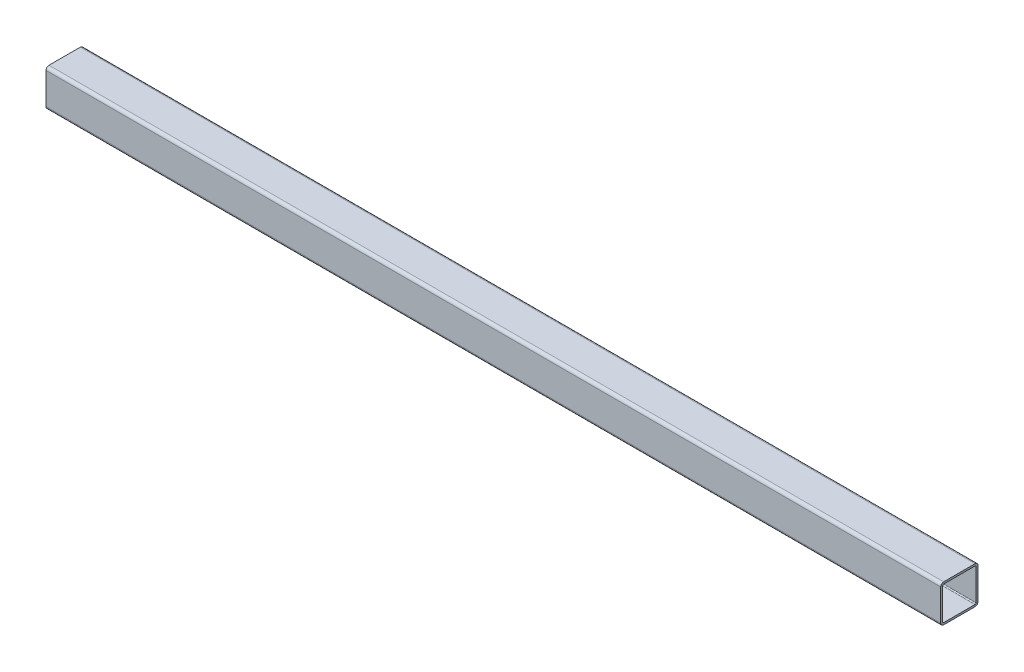
ISO-10303-21;
HEADER;
FILE_DESCRIPTION(('STEP AP214'),'2;1');
FILE_NAME('part.step','',(''),(''),'','','');
FILE_SCHEMA(('AUTOMOTIVE_DESIGN { 1 0 10303 214 1 1 1 1 }'));
ENDSEC;
DATA;
#1=APPLICATION_CONTEXT('core data for automotive mechanical design processes');
#2=APPLICATION_PROTOCOL_DEFINITION('international standard','automotive_design',2000,#1);
#3=PRODUCT_CONTEXT('',#1,'mechanical');
#4=PRODUCT('Part','Part','',(#3));
#5=PRODUCT_RELATED_PRODUCT_CATEGORY('part','',(#4));
#6=PRODUCT_DEFINITION_FORMATION('','',#4);
#7=PRODUCT_DEFINITION_CONTEXT('part definition',#1,'design');
#8=PRODUCT_DEFINITION('design','',#6,#7);
#9=PRODUCT_DEFINITION_SHAPE('','',#8);
#10=(LENGTH_UNIT() NAMED_UNIT(*) SI_UNIT(.MILLI.,.METRE.));
#11=(NAMED_UNIT(*) PLANE_ANGLE_UNIT() SI_UNIT($,.RADIAN.));
#12=(NAMED_UNIT(*) SI_UNIT($,.STERADIAN.) SOLID_ANGLE_UNIT());
#13=UNCERTAINTY_MEASURE_WITH_UNIT(LENGTH_MEASURE(1.E-05),#10,'distance_accuracy_value','');
#14=(GEOMETRIC_REPRESENTATION_CONTEXT(3) GLOBAL_UNCERTAINTY_ASSIGNED_CONTEXT((#13)) GLOBAL_UNIT_ASSIGNED_CONTEXT((#10,
#11,#12)) REPRESENTATION_CONTEXT('',''));
#15=CARTESIAN_POINT('',(0.,0.,0.));
#16=DIRECTION('',(0.,0.,1.));
#17=DIRECTION('',(1.,0.,0.));
#18=AXIS2_PLACEMENT_3D('',#15,#16,#17);
#19=CARTESIAN_POINT('',(304.8,10.541,21.209));
#20=DIRECTION('',(1.,0.,0.));
#21=DIRECTION('',(0.,0.,-1.));
#22=AXIS2_PLACEMENT_3D('',#19,#20,#21);
#23=PLANE('',#22);
#24=CARTESIAN_POINT('',(304.8,10.541,21.209));
#25=DIRECTION('',(1.,0.,0.));
#26=DIRECTION('',(0.,0.,-1.));
#27=AXIS2_PLACEMENT_3D('',#24,#25,#26);
#28=CIRCLE('',#27,1.016);
#29=CARTESIAN_POINT('',(304.8,10.541,22.225));
#30=VERTEX_POINT('',#29);
#31=CARTESIAN_POINT('',(304.8,9.525,21.209));
#32=VERTEX_POINT('',#31);
#33=EDGE_CURVE('E266',#30,#32,#28,.T.);
#34=ORIENTED_EDGE('',*,*,#33,.T.);
#35=DIRECTION('',(0.,0.,-1.));
#36=VECTOR('',#35,1.);
#37=CARTESIAN_POINT('',(304.8,9.525,21.209));
#38=LINE('',#37,#36);
#39=CARTESIAN_POINT('',(304.8,9.525,10.541));
#40=VERTEX_POINT('',#39);
#41=EDGE_CURVE('E494',#32,#40,#38,.T.);
#42=ORIENTED_EDGE('',*,*,#41,.T.);
#43=CARTESIAN_POINT('',(304.8,10.541,10.541));
#44=DIRECTION('',(1.,0.,0.));
#45=DIRECTION('',(0.,0.,-1.));
#46=AXIS2_PLACEMENT_3D('',#43,#44,#45);
#47=CIRCLE('',#46,1.016);
#48=CARTESIAN_POINT('',(304.8,10.541,9.525));
#49=VERTEX_POINT('',#48);
#50=EDGE_CURVE('E167',#40,#49,#47,.T.);
#51=ORIENTED_EDGE('',*,*,#50,.T.);
#52=DIRECTION('',(0.,1.,0.));
#53=VECTOR('',#52,1.);
#54=CARTESIAN_POINT('',(304.8,10.541,9.525));
#55=LINE('',#54,#53);
#56=CARTESIAN_POINT('',(304.8,21.209,9.525));
#57=VERTEX_POINT('',#56);
#58=EDGE_CURVE('E480',#49,#57,#55,.T.);
#59=ORIENTED_EDGE('',*,*,#58,.T.);
#60=CARTESIAN_POINT('',(304.8,21.209,10.541));
#61=DIRECTION('',(1.,0.,0.));
#62=DIRECTION('',(0.,0.,-1.));
#63=AXIS2_PLACEMENT_3D('',#60,#61,#62);
#64=CIRCLE('',#63,1.016);
#65=CARTESIAN_POINT('',(304.8,22.225,10.541));
#66=VERTEX_POINT('',#65);
#67=EDGE_CURVE('E489',#57,#66,#64,.T.);
#68=ORIENTED_EDGE('',*,*,#67,.T.);
#69=DIRECTION('',(0.,0.,1.));
#70=VECTOR('',#69,1.);
#71=CARTESIAN_POINT('',(304.8,22.225,10.541));
#72=LINE('',#71,#70);
#73=CARTESIAN_POINT('',(304.8,22.225,21.209));
#74=VERTEX_POINT('',#73);
#75=EDGE_CURVE('E282',#66,#74,#72,.T.);
#76=ORIENTED_EDGE('',*,*,#75,.T.);
#77=CARTESIAN_POINT('',(304.8,21.209,21.209));
#78=DIRECTION('',(1.,0.,0.));
#79=DIRECTION('',(0.,0.,-1.));
#80=AXIS2_PLACEMENT_3D('',#77,#78,#79);
#81=CIRCLE('',#80,1.016);
#82=CARTESIAN_POINT('',(304.8,21.209,22.225));
#83=VERTEX_POINT('',#82);
#84=EDGE_CURVE('E299',#74,#83,#81,.T.);
#85=ORIENTED_EDGE('',*,*,#84,.T.);
#86=DIRECTION('',(0.,-1.,0.));
#87=VECTOR('',#86,1.);
#88=CARTESIAN_POINT('',(304.8,21.209,22.225));
#89=LINE('',#88,#87);
#90=EDGE_CURVE('E263',#83,#30,#89,.T.);
#91=ORIENTED_EDGE('',*,*,#90,.T.);
#92=EDGE_LOOP('',(#34,#42,#51,#59,#68,#76,#85,#91));
#93=FACE_BOUND('',#92,.T.);
#94=DIRECTION('',(0.,1.,0.));
#95=VECTOR('',#94,1.);
#96=CARTESIAN_POINT('',(304.8,10.541,10.1854));
#97=LINE('',#96,#95);
#98=CARTESIAN_POINT('',(304.8,10.541,10.1854));
#99=VERTEX_POINT('',#98);
#100=CARTESIAN_POINT('',(304.8,21.209,10.1854));
#101=VERTEX_POINT('',#100);
#102=EDGE_CURVE('E259',#99,#101,#97,.T.);
#103=ORIENTED_EDGE('',*,*,#102,.F.);
#104=CARTESIAN_POINT('',(304.8,10.541,10.541));
#105=DIRECTION('',(1.,0.,0.));
#106=DIRECTION('',(0.,0.,-1.));
#107=AXIS2_PLACEMENT_3D('',#104,#105,#106);
#108=CIRCLE('',#107,0.355600000000001);
#109=CARTESIAN_POINT('',(304.8,10.1854,10.541));
#110=VERTEX_POINT('',#109);
#111=EDGE_CURVE('E106',#110,#99,#108,.T.);
#112=ORIENTED_EDGE('',*,*,#111,.F.);
#113=DIRECTION('',(0.,0.,-1.));
#114=VECTOR('',#113,1.);
#115=CARTESIAN_POINT('',(304.8,10.1854,21.209));
#116=LINE('',#115,#114);
#117=CARTESIAN_POINT('',(304.8,10.1854,21.209));
#118=VERTEX_POINT('',#117);
#119=EDGE_CURVE('E218',#118,#110,#116,.T.);
#120=ORIENTED_EDGE('',*,*,#119,.F.);
#121=CARTESIAN_POINT('',(304.8,10.541,21.209));
#122=DIRECTION('',(1.,0.,0.));
#123=DIRECTION('',(0.,0.,-1.));
#124=AXIS2_PLACEMENT_3D('',#121,#122,#123);
#125=CIRCLE('',#124,0.355599999999998);
#126=CARTESIAN_POINT('',(304.8,10.541,21.5646));
#127=VERTEX_POINT('',#126);
#128=EDGE_CURVE('E249',#127,#118,#125,.T.);
#129=ORIENTED_EDGE('',*,*,#128,.F.);
#130=DIRECTION('',(0.,-1.,0.));
#131=VECTOR('',#130,1.);
#132=CARTESIAN_POINT('',(304.8,21.209,21.5646));
#133=LINE('',#132,#131);
#134=CARTESIAN_POINT('',(304.8,21.209,21.5646));
#135=VERTEX_POINT('',#134);
#136=EDGE_CURVE('E235',#135,#127,#133,.T.);
#137=ORIENTED_EDGE('',*,*,#136,.F.);
#138=CARTESIAN_POINT('',(304.8,21.209,21.209));
#139=DIRECTION('',(1.,0.,0.));
#140=DIRECTION('',(0.,0.,-1.));
#141=AXIS2_PLACEMENT_3D('',#138,#139,#140);
#142=CIRCLE('',#141,0.355600000000006);
#143=CARTESIAN_POINT('',(304.8,21.5646,21.209));
#144=VERTEX_POINT('',#143);
#145=EDGE_CURVE('E244',#144,#135,#142,.T.);
#146=ORIENTED_EDGE('',*,*,#145,.F.);
#147=DIRECTION('',(0.,0.,1.));
#148=VECTOR('',#147,1.);
#149=CARTESIAN_POINT('',(304.8,21.5646,10.541));
#150=LINE('',#149,#148);
#151=CARTESIAN_POINT('',(304.8,21.5646,10.541));
#152=VERTEX_POINT('',#151);
#153=EDGE_CURVE('E252',#152,#144,#150,.T.);
#154=ORIENTED_EDGE('',*,*,#153,.F.);
#155=CARTESIAN_POINT('',(304.8,21.209,10.541));
#156=DIRECTION('',(1.,2.66488927723138E-13,-2.66488927723138E-13));
#157=DIRECTION('',(-2.66488927723138E-13,0.,-1.));
#158=AXIS2_PLACEMENT_3D('',#155,#156,#157);
#159=CIRCLE('',#158,0.355599999999998);
#160=EDGE_CURVE('E257',#101,#152,#159,.T.);
#161=ORIENTED_EDGE('',*,*,#160,.F.);
#162=EDGE_LOOP('',(#103,#112,#120,#129,#137,#146,#154,#161));
#163=FACE_BOUND('',#162,.T.);
#164=ADVANCED_FACE('F47',(#93,#163),#23,.T.);
#165=CARTESIAN_POINT('',(0.,10.541,21.209));
#166=DIRECTION('',(1.,0.,0.));
#167=DIRECTION('',(0.,0.,-1.));
#168=AXIS2_PLACEMENT_3D('',#165,#166,#167);
#169=PLANE('',#168);
#170=CARTESIAN_POINT('',(0.,10.541,21.209));
#171=DIRECTION('',(1.,0.,0.));
#172=DIRECTION('',(0.,0.,-1.));
#173=AXIS2_PLACEMENT_3D('',#170,#171,#172);
#174=CIRCLE('',#173,1.016);
#175=CARTESIAN_POINT('',(0.,10.541,22.225));
#176=VERTEX_POINT('',#175);
#177=CARTESIAN_POINT('',(0.,9.525,21.209));
#178=VERTEX_POINT('',#177);
#179=EDGE_CURVE('E160',#176,#178,#174,.T.);
#180=ORIENTED_EDGE('',*,*,#179,.F.);
#181=DIRECTION('',(0.,-1.,0.));
#182=VECTOR('',#181,1.);
#183=CARTESIAN_POINT('',(0.,21.209,22.225));
#184=LINE('',#183,#182);
#185=CARTESIAN_POINT('',(0.,21.209,22.225));
#186=VERTEX_POINT('',#185);
#187=EDGE_CURVE('E264',#186,#176,#184,.T.);
#188=ORIENTED_EDGE('',*,*,#187,.F.);
#189=CARTESIAN_POINT('',(0.,21.209,21.209));
#190=DIRECTION('',(1.,0.,0.));
#191=DIRECTION('',(0.,0.,-1.));
#192=AXIS2_PLACEMENT_3D('',#189,#190,#191);
#193=CIRCLE('',#192,1.016);
#194=CARTESIAN_POINT('',(0.,22.225,21.209));
#195=VERTEX_POINT('',#194);
#196=EDGE_CURVE('E267',#195,#186,#193,.T.);
#197=ORIENTED_EDGE('',*,*,#196,.F.);
#198=DIRECTION('',(0.,0.,1.));
#199=VECTOR('',#198,1.);
#200=CARTESIAN_POINT('',(0.,22.225,10.541));
#201=LINE('',#200,#199);
#202=CARTESIAN_POINT('',(0.,22.225,10.541));
#203=VERTEX_POINT('',#202);
#204=EDGE_CURVE('E269',#203,#195,#201,.T.);
#205=ORIENTED_EDGE('',*,*,#204,.F.);
#206=CARTESIAN_POINT('',(0.,21.209,10.541));
#207=DIRECTION('',(1.,0.,0.));
#208=DIRECTION('',(0.,0.,-1.));
#209=AXIS2_PLACEMENT_3D('',#206,#207,#208);
#210=CIRCLE('',#209,1.016);
#211=CARTESIAN_POINT('',(0.,21.209,9.525));
#212=VERTEX_POINT('',#211);
#213=EDGE_CURVE('E176',#212,#203,#210,.T.);
#214=ORIENTED_EDGE('',*,*,#213,.F.);
#215=DIRECTION('',(0.,1.,0.));
#216=VECTOR('',#215,1.);
#217=CARTESIAN_POINT('',(0.,10.541,9.525));
#218=LINE('',#217,#216);
#219=CARTESIAN_POINT('',(0.,10.541,9.525));
#220=VERTEX_POINT('',#219);
#221=EDGE_CURVE('E174',#220,#212,#218,.T.);
#222=ORIENTED_EDGE('',*,*,#221,.F.);
#223=CARTESIAN_POINT('',(0.,10.541,10.541));
#224=DIRECTION('',(1.,0.,0.));
#225=DIRECTION('',(0.,0.,-1.));
#226=AXIS2_PLACEMENT_3D('',#223,#224,#225);
#227=CIRCLE('',#226,1.016);
#228=CARTESIAN_POINT('',(0.,9.525,10.541));
#229=VERTEX_POINT('',#228);
#230=EDGE_CURVE('E159',#229,#220,#227,.T.);
#231=ORIENTED_EDGE('',*,*,#230,.F.);
#232=DIRECTION('',(0.,0.,-1.));
#233=VECTOR('',#232,1.);
#234=CARTESIAN_POINT('',(0.,9.525,21.209));
#235=LINE('',#234,#233);
#236=EDGE_CURVE('E149',#178,#229,#235,.T.);
#237=ORIENTED_EDGE('',*,*,#236,.F.);
#238=EDGE_LOOP('',(#180,#188,#197,#205,#214,#222,#231,#237));
#239=FACE_BOUND('',#238,.T.);
#240=CARTESIAN_POINT('',(0.,10.541,10.541));
#241=DIRECTION('',(1.,0.,0.));
#242=DIRECTION('',(0.,0.,-1.));
#243=AXIS2_PLACEMENT_3D('',#240,#241,#242);
#244=CIRCLE('',#243,0.355600000000001);
#245=CARTESIAN_POINT('',(0.,10.1854,10.541));
#246=VERTEX_POINT('',#245);
#247=CARTESIAN_POINT('',(0.,10.541,10.1854));
#248=VERTEX_POINT('',#247);
#249=EDGE_CURVE('E72',#246,#248,#244,.T.);
#250=ORIENTED_EDGE('',*,*,#249,.T.);
#251=DIRECTION('',(0.,1.,0.));
#252=VECTOR('',#251,1.);
#253=CARTESIAN_POINT('',(0.,10.541,10.1854));
#254=LINE('',#253,#252);
#255=CARTESIAN_POINT('',(0.,21.209,10.1854));
#256=VERTEX_POINT('',#255);
#257=EDGE_CURVE('E181',#248,#256,#254,.T.);
#258=ORIENTED_EDGE('',*,*,#257,.T.);
#259=CARTESIAN_POINT('',(0.,21.209,10.541));
#260=DIRECTION('',(1.,0.,0.));
#261=DIRECTION('',(0.,0.,-1.));
#262=AXIS2_PLACEMENT_3D('',#259,#260,#261);
#263=CIRCLE('',#262,0.355599999999998);
#264=CARTESIAN_POINT('',(0.,21.5646,10.541));
#265=VERTEX_POINT('',#264);
#266=EDGE_CURVE('E184',#256,#265,#263,.T.);
#267=ORIENTED_EDGE('',*,*,#266,.T.);
#268=DIRECTION('',(0.,0.,1.));
#269=VECTOR('',#268,1.);
#270=CARTESIAN_POINT('',(0.,21.5646,10.541));
#271=LINE('',#270,#269);
#272=CARTESIAN_POINT('',(0.,21.5646,21.209));
#273=VERTEX_POINT('',#272);
#274=EDGE_CURVE('E187',#265,#273,#271,.T.);
#275=ORIENTED_EDGE('',*,*,#274,.T.);
#276=CARTESIAN_POINT('',(0.,21.209,21.209));
#277=DIRECTION('',(1.,0.,0.));
#278=DIRECTION('',(0.,0.,-1.));
#279=AXIS2_PLACEMENT_3D('',#276,#277,#278);
#280=CIRCLE('',#279,0.355600000000006);
#281=CARTESIAN_POINT('',(0.,21.209,21.5646));
#282=VERTEX_POINT('',#281);
#283=EDGE_CURVE('E190',#273,#282,#280,.T.);
#284=ORIENTED_EDGE('',*,*,#283,.T.);
#285=DIRECTION('',(0.,-1.,0.));
#286=VECTOR('',#285,1.);
#287=CARTESIAN_POINT('',(0.,21.209,21.5646));
#288=LINE('',#287,#286);
#289=CARTESIAN_POINT('',(0.,10.541,21.5646));
#290=VERTEX_POINT('',#289);
#291=EDGE_CURVE('E193',#282,#290,#288,.T.);
#292=ORIENTED_EDGE('',*,*,#291,.T.);
#293=CARTESIAN_POINT('',(0.,10.541,21.209));
#294=DIRECTION('',(1.,0.,0.));
#295=DIRECTION('',(0.,0.,-1.));
#296=AXIS2_PLACEMENT_3D('',#293,#294,#295);
#297=CIRCLE('',#296,0.355599999999998);
#298=CARTESIAN_POINT('',(0.,10.1854,21.209));
#299=VERTEX_POINT('',#298);
#300=EDGE_CURVE('E196',#290,#299,#297,.T.);
#301=ORIENTED_EDGE('',*,*,#300,.T.);
#302=DIRECTION('',(0.,0.,-1.));
#303=VECTOR('',#302,1.);
#304=CARTESIAN_POINT('',(0.,10.1854,21.209));
#305=LINE('',#304,#303);
#306=EDGE_CURVE('E199',#299,#246,#305,.T.);
#307=ORIENTED_EDGE('',*,*,#306,.T.);
#308=EDGE_LOOP('',(#250,#258,#267,#275,#284,#292,#301,#307));
#309=FACE_BOUND('',#308,.T.);
#310=ADVANCED_FACE('F171',(#239,#309),#169,.F.);
#311=CARTESIAN_POINT('',(304.8,10.541,21.209));
#312=DIRECTION('',(-1.,0.,0.));
#313=DIRECTION('',(0.,-1.,0.));
#314=AXIS2_PLACEMENT_3D('',#311,#312,#313);
#315=CYLINDRICAL_SURFACE('',#314,1.016);
#316=ORIENTED_EDGE('',*,*,#179,.T.);
#317=DIRECTION('',(-1.,0.,0.));
#318=VECTOR('',#317,1.);
#319=CARTESIAN_POINT('',(304.8,9.525,21.209));
#320=LINE('',#319,#318);
#321=EDGE_CURVE('E11',#32,#178,#320,.T.);
#322=ORIENTED_EDGE('',*,*,#321,.F.);
#323=ORIENTED_EDGE('',*,*,#33,.F.);
#324=DIRECTION('',(-1.,0.,0.));
#325=VECTOR('',#324,1.);
#326=CARTESIAN_POINT('',(304.8,10.541,22.225));
#327=LINE('',#326,#325);
#328=EDGE_CURVE('E215',#30,#176,#327,.T.);
#329=ORIENTED_EDGE('',*,*,#328,.T.);
#330=EDGE_LOOP('',(#316,#322,#323,#329));
#331=FACE_BOUND('',#330,.T.);
#332=ADVANCED_FACE('F329',(#331),#315,.T.);
#333=CARTESIAN_POINT('',(304.8,9.525,21.209));
#334=DIRECTION('',(0.,1.,0.));
#335=DIRECTION('',(0.,0.,1.));
#336=AXIS2_PLACEMENT_3D('',#333,#334,#335);
#337=PLANE('',#336);
#338=ORIENTED_EDGE('',*,*,#236,.T.);
#339=DIRECTION('',(-1.,0.,0.));
#340=VECTOR('',#339,1.);
#341=CARTESIAN_POINT('',(304.8,9.525,10.541));
#342=LINE('',#341,#340);
#343=EDGE_CURVE('E56',#40,#229,#342,.T.);
#344=ORIENTED_EDGE('',*,*,#343,.F.);
#345=ORIENTED_EDGE('',*,*,#41,.F.);
#346=ORIENTED_EDGE('',*,*,#321,.T.);
#347=EDGE_LOOP('',(#338,#344,#345,#346));
#348=FACE_BOUND('',#347,.T.);
#349=ADVANCED_FACE('F153',(#348),#337,.F.);
#350=CARTESIAN_POINT('',(304.8,10.541,10.541));
#351=DIRECTION('',(-1.,0.,0.));
#352=DIRECTION('',(0.,-1.,0.));
#353=AXIS2_PLACEMENT_3D('',#350,#351,#352);
#354=CYLINDRICAL_SURFACE('',#353,1.016);
#355=ORIENTED_EDGE('',*,*,#230,.T.);
#356=DIRECTION('',(-1.,0.,0.));
#357=VECTOR('',#356,1.);
#358=CARTESIAN_POINT('',(304.8,10.541,9.525));
#359=LINE('',#358,#357);
#360=EDGE_CURVE('E168',#49,#220,#359,.T.);
#361=ORIENTED_EDGE('',*,*,#360,.F.);
#362=ORIENTED_EDGE('',*,*,#50,.F.);
#363=ORIENTED_EDGE('',*,*,#343,.T.);
#364=EDGE_LOOP('',(#355,#361,#362,#363));
#365=FACE_BOUND('',#364,.T.);
#366=ADVANCED_FACE('F163',(#365),#354,.T.);
#367=CARTESIAN_POINT('',(304.8,10.541,9.525));
#368=DIRECTION('',(0.,0.,1.));
#369=DIRECTION('',(1.,0.,0.));
#370=AXIS2_PLACEMENT_3D('',#367,#368,#369);
#371=PLANE('',#370);
#372=ORIENTED_EDGE('',*,*,#221,.T.);
#373=DIRECTION('',(-1.,0.,0.));
#374=VECTOR('',#373,1.);
#375=CARTESIAN_POINT('',(304.8,21.209,9.525));
#376=LINE('',#375,#374);
#377=EDGE_CURVE('E203',#57,#212,#376,.T.);
#378=ORIENTED_EDGE('',*,*,#377,.F.);
#379=ORIENTED_EDGE('',*,*,#58,.F.);
#380=ORIENTED_EDGE('',*,*,#360,.T.);
#381=EDGE_LOOP('',(#372,#378,#379,#380));
#382=FACE_BOUND('',#381,.T.);
#383=ADVANCED_FACE('F339',(#382),#371,.F.);
#384=CARTESIAN_POINT('',(304.8,21.209,10.541));
#385=DIRECTION('',(-1.,0.,0.));
#386=DIRECTION('',(0.,-1.,0.));
#387=AXIS2_PLACEMENT_3D('',#384,#385,#386);
#388=CYLINDRICAL_SURFACE('',#387,1.016);
#389=ORIENTED_EDGE('',*,*,#213,.T.);
#390=DIRECTION('',(-1.,0.,0.));
#391=VECTOR('',#390,1.);
#392=CARTESIAN_POINT('',(304.8,22.225,10.541));
#393=LINE('',#392,#391);
#394=EDGE_CURVE('E206',#66,#203,#393,.T.);
#395=ORIENTED_EDGE('',*,*,#394,.F.);
#396=ORIENTED_EDGE('',*,*,#67,.F.);
#397=ORIENTED_EDGE('',*,*,#377,.T.);
#398=EDGE_LOOP('',(#389,#395,#396,#397));
#399=FACE_BOUND('',#398,.T.);
#400=ADVANCED_FACE('F272',(#399),#388,.T.);
#401=CARTESIAN_POINT('',(304.8,22.225,10.541));
#402=DIRECTION('',(0.,-1.,0.));
#403=DIRECTION('',(0.,0.,-1.));
#404=AXIS2_PLACEMENT_3D('',#401,#402,#403);
#405=PLANE('',#404);
#406=ORIENTED_EDGE('',*,*,#204,.T.);
#407=DIRECTION('',(-1.,0.,0.));
#408=VECTOR('',#407,1.);
#409=CARTESIAN_POINT('',(304.8,22.225,21.209));
#410=LINE('',#409,#408);
#411=EDGE_CURVE('E209',#74,#195,#410,.T.);
#412=ORIENTED_EDGE('',*,*,#411,.F.);
#413=ORIENTED_EDGE('',*,*,#75,.F.);
#414=ORIENTED_EDGE('',*,*,#394,.T.);
#415=EDGE_LOOP('',(#406,#412,#413,#414));
#416=FACE_BOUND('',#415,.T.);
#417=ADVANCED_FACE('F279',(#416),#405,.F.);
#418=CARTESIAN_POINT('',(304.8,21.209,21.209));
#419=DIRECTION('',(-1.,0.,0.));
#420=DIRECTION('',(0.,-1.,0.));
#421=AXIS2_PLACEMENT_3D('',#418,#419,#420);
#422=CYLINDRICAL_SURFACE('',#421,1.016);
#423=ORIENTED_EDGE('',*,*,#196,.T.);
#424=DIRECTION('',(-1.,0.,0.));
#425=VECTOR('',#424,1.);
#426=CARTESIAN_POINT('',(304.8,21.209,22.225));
#427=LINE('',#426,#425);
#428=EDGE_CURVE('E212',#83,#186,#427,.T.);
#429=ORIENTED_EDGE('',*,*,#428,.F.);
#430=ORIENTED_EDGE('',*,*,#84,.F.);
#431=ORIENTED_EDGE('',*,*,#411,.T.);
#432=EDGE_LOOP('',(#423,#429,#430,#431));
#433=FACE_BOUND('',#432,.T.);
#434=ADVANCED_FACE('F287',(#433),#422,.T.);
#435=CARTESIAN_POINT('',(304.8,21.209,22.225));
#436=DIRECTION('',(0.,0.,-1.));
#437=DIRECTION('',(0.,1.,0.));
#438=AXIS2_PLACEMENT_3D('',#435,#436,#437);
#439=PLANE('',#438);
#440=ORIENTED_EDGE('',*,*,#187,.T.);
#441=ORIENTED_EDGE('',*,*,#328,.F.);
#442=ORIENTED_EDGE('',*,*,#90,.F.);
#443=ORIENTED_EDGE('',*,*,#428,.T.);
#444=EDGE_LOOP('',(#440,#441,#442,#443));
#445=FACE_BOUND('',#444,.T.);
#446=ADVANCED_FACE('F291',(#445),#439,.F.);
#447=CARTESIAN_POINT('',(304.8,10.541,10.541));
#448=DIRECTION('',(-1.,0.,0.));
#449=DIRECTION('',(0.,-1.,0.));
#450=AXIS2_PLACEMENT_3D('',#447,#448,#449);
#451=CYLINDRICAL_SURFACE('',#450,0.3556);
#452=ORIENTED_EDGE('',*,*,#249,.F.);
#453=DIRECTION('',(-1.,0.,0.));
#454=VECTOR('',#453,1.);
#455=CARTESIAN_POINT('',(304.8,10.1854,10.541));
#456=LINE('',#455,#454);
#457=EDGE_CURVE('E216',#110,#246,#456,.T.);
#458=ORIENTED_EDGE('',*,*,#457,.F.);
#459=ORIENTED_EDGE('',*,*,#111,.T.);
#460=DIRECTION('',(-1.,0.,0.));
#461=VECTOR('',#460,1.);
#462=CARTESIAN_POINT('',(304.8,10.541,10.1854));
#463=LINE('',#462,#461);
#464=EDGE_CURVE('E219',#99,#248,#463,.T.);
#465=ORIENTED_EDGE('',*,*,#464,.T.);
#466=EDGE_LOOP('',(#452,#458,#459,#465));
#467=FACE_BOUND('',#466,.T.);
#468=ADVANCED_FACE('F305',(#467),#451,.F.);
#469=CARTESIAN_POINT('',(304.8,10.541,10.1854));
#470=DIRECTION('',(0.,0.,1.));
#471=DIRECTION('',(1.,0.,0.));
#472=AXIS2_PLACEMENT_3D('',#469,#470,#471);
#473=PLANE('',#472);
#474=ORIENTED_EDGE('',*,*,#257,.F.);
#475=ORIENTED_EDGE('',*,*,#464,.F.);
#476=ORIENTED_EDGE('',*,*,#102,.T.);
#477=DIRECTION('',(-1.,0.,0.));
#478=VECTOR('',#477,1.);
#479=CARTESIAN_POINT('',(304.8,21.209,10.1854));
#480=LINE('',#479,#478);
#481=EDGE_CURVE('E221',#101,#256,#480,.T.);
#482=ORIENTED_EDGE('',*,*,#481,.T.);
#483=EDGE_LOOP('',(#474,#475,#476,#482));
#484=FACE_BOUND('',#483,.T.);
#485=ADVANCED_FACE('F309',(#484),#473,.T.);
#486=CARTESIAN_POINT('',(304.8,21.209,10.541));
#487=DIRECTION('',(-1.,0.,0.));
#488=DIRECTION('',(0.,-1.,0.));
#489=AXIS2_PLACEMENT_3D('',#486,#487,#488);
#490=CYLINDRICAL_SURFACE('',#489,0.3556);
#491=ORIENTED_EDGE('',*,*,#266,.F.);
#492=ORIENTED_EDGE('',*,*,#481,.F.);
#493=ORIENTED_EDGE('',*,*,#160,.T.);
#494=DIRECTION('',(-1.,0.,0.));
#495=VECTOR('',#494,1.);
#496=CARTESIAN_POINT('',(304.8,21.5646,10.541));
#497=LINE('',#496,#495);
#498=EDGE_CURVE('E223',#152,#265,#497,.T.);
#499=ORIENTED_EDGE('',*,*,#498,.T.);
#500=EDGE_LOOP('',(#491,#492,#493,#499));
#501=FACE_BOUND('',#500,.T.);
#502=ADVANCED_FACE('F312',(#501),#490,.F.);
#503=CARTESIAN_POINT('',(304.8,21.5646,10.541));
#504=DIRECTION('',(0.,-1.,0.));
#505=DIRECTION('',(0.,0.,-1.));
#506=AXIS2_PLACEMENT_3D('',#503,#504,#505);
#507=PLANE('',#506);
#508=ORIENTED_EDGE('',*,*,#274,.F.);
#509=ORIENTED_EDGE('',*,*,#498,.F.);
#510=ORIENTED_EDGE('',*,*,#153,.T.);
#511=DIRECTION('',(-1.,0.,0.));
#512=VECTOR('',#511,1.);
#513=CARTESIAN_POINT('',(304.8,21.5646,21.209));
#514=LINE('',#513,#512);
#515=EDGE_CURVE('E225',#144,#273,#514,.T.);
#516=ORIENTED_EDGE('',*,*,#515,.T.);
#517=EDGE_LOOP('',(#508,#509,#510,#516));
#518=FACE_BOUND('',#517,.T.);
#519=ADVANCED_FACE('F315',(#518),#507,.T.);
#520=CARTESIAN_POINT('',(304.8,21.209,21.209));
#521=DIRECTION('',(-1.,0.,0.));
#522=DIRECTION('',(0.,-1.,0.));
#523=AXIS2_PLACEMENT_3D('',#520,#521,#522);
#524=CYLINDRICAL_SURFACE('',#523,0.355600000000001);
#525=ORIENTED_EDGE('',*,*,#283,.F.);
#526=ORIENTED_EDGE('',*,*,#515,.F.);
#527=ORIENTED_EDGE('',*,*,#145,.T.);
#528=DIRECTION('',(-1.,0.,0.));
#529=VECTOR('',#528,1.);
#530=CARTESIAN_POINT('',(304.8,21.209,21.5646));
#531=LINE('',#530,#529);
#532=EDGE_CURVE('E227',#135,#282,#531,.T.);
#533=ORIENTED_EDGE('',*,*,#532,.T.);
#534=EDGE_LOOP('',(#525,#526,#527,#533));
#535=FACE_BOUND('',#534,.T.);
#536=ADVANCED_FACE('F242',(#535),#524,.F.);
#537=CARTESIAN_POINT('',(304.8,21.209,21.5646));
#538=DIRECTION('',(0.,0.,-1.));
#539=DIRECTION('',(-1.,0.,0.));
#540=AXIS2_PLACEMENT_3D('',#537,#538,#539);
#541=PLANE('',#540);
#542=ORIENTED_EDGE('',*,*,#291,.F.);
#543=ORIENTED_EDGE('',*,*,#532,.F.);
#544=ORIENTED_EDGE('',*,*,#136,.T.);
#545=DIRECTION('',(-1.,0.,0.));
#546=VECTOR('',#545,1.);
#547=CARTESIAN_POINT('',(304.8,10.541,21.5646));
#548=LINE('',#547,#546);
#549=EDGE_CURVE('E228',#127,#290,#548,.T.);
#550=ORIENTED_EDGE('',*,*,#549,.T.);
#551=EDGE_LOOP('',(#542,#543,#544,#550));
#552=FACE_BOUND('',#551,.T.);
#553=ADVANCED_FACE('F232',(#552),#541,.T.);
#554=CARTESIAN_POINT('',(304.8,10.541,21.209));
#555=DIRECTION('',(-1.,0.,0.));
#556=DIRECTION('',(0.,-1.,0.));
#557=AXIS2_PLACEMENT_3D('',#554,#555,#556);
#558=CYLINDRICAL_SURFACE('',#557,0.355600000000003);
#559=ORIENTED_EDGE('',*,*,#300,.F.);
#560=ORIENTED_EDGE('',*,*,#549,.F.);
#561=ORIENTED_EDGE('',*,*,#128,.T.);
#562=DIRECTION('',(-1.,0.,0.));
#563=VECTOR('',#562,1.);
#564=CARTESIAN_POINT('',(304.8,10.1854,21.209));
#565=LINE('',#564,#563);
#566=EDGE_CURVE('E51',#118,#299,#565,.T.);
#567=ORIENTED_EDGE('',*,*,#566,.T.);
#568=EDGE_LOOP('',(#559,#560,#561,#567));
#569=FACE_BOUND('',#568,.T.);
#570=ADVANCED_FACE('F237',(#569),#558,.F.);
#571=CARTESIAN_POINT('',(304.8,10.1854,21.209));
#572=DIRECTION('',(0.,1.,0.));
#573=DIRECTION('',(0.,0.,1.));
#574=AXIS2_PLACEMENT_3D('',#571,#572,#573);
#575=PLANE('',#574);
#576=ORIENTED_EDGE('',*,*,#306,.F.);
#577=ORIENTED_EDGE('',*,*,#566,.F.);
#578=ORIENTED_EDGE('',*,*,#119,.T.);
#579=ORIENTED_EDGE('',*,*,#457,.T.);
#580=EDGE_LOOP('',(#576,#577,#578,#579));
#581=FACE_BOUND('',#580,.T.);
#582=ADVANCED_FACE('F49',(#581),#575,.T.);
#583=CLOSED_SHELL('',(#164,#310,#332,#349,#366,#383,#400,#417,#434,#446,#468,#485,#502,#519,
#536,#553,#570,#582));
#584=MANIFOLD_SOLID_BREP('B2',#583);
#585=ADVANCED_BREP_SHAPE_REPRESENTATION('',(#18,#584),#14);
#586=SHAPE_DEFINITION_REPRESENTATION(#9,#585);
ENDSEC;
END-ISO-10303-21;
